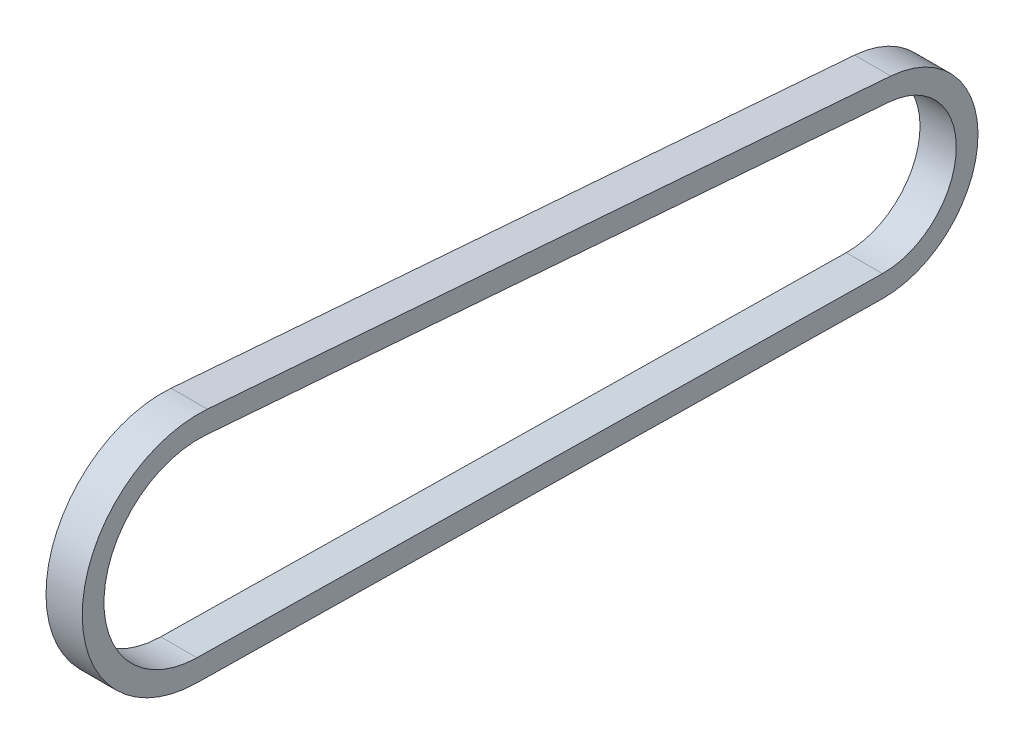
ISO-10303-21;
HEADER;
FILE_DESCRIPTION(('STEP AP214'),'2;1');
FILE_NAME('part.step','',(''),(''),'','','');
FILE_SCHEMA(('AUTOMOTIVE_DESIGN { 1 0 10303 214 1 1 1 1 }'));
ENDSEC;
DATA;
#1=APPLICATION_CONTEXT('core data for automotive mechanical design processes');
#2=APPLICATION_PROTOCOL_DEFINITION('international standard','automotive_design',2000,#1);
#3=PRODUCT_CONTEXT('',#1,'mechanical');
#4=PRODUCT('Part','Part','',(#3));
#5=PRODUCT_RELATED_PRODUCT_CATEGORY('part','',(#4));
#6=PRODUCT_DEFINITION_FORMATION('','',#4);
#7=PRODUCT_DEFINITION_CONTEXT('part definition',#1,'design');
#8=PRODUCT_DEFINITION('design','',#6,#7);
#9=PRODUCT_DEFINITION_SHAPE('','',#8);
#10=(LENGTH_UNIT() NAMED_UNIT(*) SI_UNIT(.MILLI.,.METRE.));
#11=(NAMED_UNIT(*) PLANE_ANGLE_UNIT() SI_UNIT($,.RADIAN.));
#12=(NAMED_UNIT(*) SI_UNIT($,.STERADIAN.) SOLID_ANGLE_UNIT());
#13=UNCERTAINTY_MEASURE_WITH_UNIT(LENGTH_MEASURE(1.E-05),#10,'distance_accuracy_value','');
#14=(GEOMETRIC_REPRESENTATION_CONTEXT(3) GLOBAL_UNCERTAINTY_ASSIGNED_CONTEXT((#13)) GLOBAL_UNIT_ASSIGNED_CONTEXT((#10,
#11,#12)) REPRESENTATION_CONTEXT('',''));
#15=CARTESIAN_POINT('',(0.,0.,0.));
#16=DIRECTION('',(0.,0.,1.));
#17=DIRECTION('',(1.,0.,0.));
#18=AXIS2_PLACEMENT_3D('',#15,#16,#17);
#19=CARTESIAN_POINT('',(52.5000000000001,17.5,83.629055924294));
#20=DIRECTION('',(1.,0.,0.));
#21=DIRECTION('',(0.,0.,-1.));
#22=AXIS2_PLACEMENT_3D('',#19,#20,#21);
#23=PLANE('',#22);
#24=CARTESIAN_POINT('',(52.5000000000001,17.5,83.629055924294));
#25=DIRECTION('',(1.,0.,0.));
#26=DIRECTION('',(0.,0.,-1.));
#27=AXIS2_PLACEMENT_3D('',#24,#25,#26);
#28=CIRCLE('',#27,12.814);
#29=CARTESIAN_POINT('',(52.5000000000001,30.2752862936995,82.6337388321));
#30=VERTEX_POINT('',#29);
#31=CARTESIAN_POINT('',(52.5000000000001,4.68739172846032,83.8179084595509));
#32=VERTEX_POINT('',#31);
#33=EDGE_CURVE('E140',#30,#32,#28,.T.);
#34=ORIENTED_EDGE('',*,*,#33,.T.);
#35=DIRECTION('',(0.,-0.0147379846462386,-0.999891390006218));
#36=VECTOR('',#35,1.);
#37=CARTESIAN_POINT('',(52.5,3.57213269362515,8.15370244187558));
#38=LINE('',#37,#36);
#39=CARTESIAN_POINT('',(52.5,3.57213269362515,8.15370244187558));
#40=VERTEX_POINT('',#39);
#41=EDGE_CURVE('E143',#32,#40,#38,.T.);
#42=ORIENTED_EDGE('',*,*,#41,.T.);
#43=CARTESIAN_POINT('',(52.5,14.,8.));
#44=DIRECTION('',(1.,0.,0.));
#45=DIRECTION('',(0.,0.,-1.));
#46=AXIS2_PLACEMENT_3D('',#43,#44,#45);
#47=CIRCLE('',#46,10.429);
#48=CARTESIAN_POINT('',(52.5,24.3974918649128,7.18993585496394));
#49=VERTEX_POINT('',#48);
#50=EDGE_CURVE('E146',#40,#49,#47,.T.);
#51=ORIENTED_EDGE('',*,*,#50,.T.);
#52=DIRECTION('',(0.,0.0776741916805083,0.996978796136999));
#53=VECTOR('',#52,1.);
#54=CARTESIAN_POINT('',(52.5000000000001,30.2752862936995,82.6337388321));
#55=LINE('',#54,#53);
#56=EDGE_CURVE('E148',#49,#30,#55,.T.);
#57=ORIENTED_EDGE('',*,*,#56,.T.);
#58=EDGE_LOOP('',(#34,#42,#51,#57));
#59=FACE_BOUND('',#58,.T.);
#60=DIRECTION('',(0.,-0.0147379846462386,-0.999891390006218));
#61=VECTOR('',#60,1.);
#62=CARTESIAN_POINT('',(52.5,5.97187202964007,8.11833127872461));
#63=LINE('',#62,#61);
#64=CARTESIAN_POINT('',(52.5000000000001,7.08713106447524,83.7825372964));
#65=VERTEX_POINT('',#64);
#66=CARTESIAN_POINT('',(52.5,5.97187202964007,8.11833127872461));
#67=VERTEX_POINT('',#66);
#68=EDGE_CURVE('E112',#65,#67,#63,.T.);
#69=ORIENTED_EDGE('',*,*,#68,.F.);
#70=CARTESIAN_POINT('',(52.5000000000001,17.5,83.629055924294));
#71=DIRECTION('',(1.,0.,0.));
#72=DIRECTION('',(0.,0.,-1.));
#73=AXIS2_PLACEMENT_3D('',#70,#71,#72);
#74=CIRCLE('',#73,10.414);
#75=CARTESIAN_POINT('',(52.5000000000001,27.8825371829707,82.8201568921332));
#76=VERTEX_POINT('',#75);
#77=EDGE_CURVE('E104',#76,#65,#74,.T.);
#78=ORIENTED_EDGE('',*,*,#77,.F.);
#79=DIRECTION('',(0.,0.0776741916805083,0.996978796136999));
#80=VECTOR('',#79,1.);
#81=CARTESIAN_POINT('',(52.5000000000001,27.8825371829707,82.8201568921332));
#82=LINE('',#81,#80);
#83=CARTESIAN_POINT('',(52.5,22.004742754184,7.37635391499716));
#84=VERTEX_POINT('',#83);
#85=EDGE_CURVE('E126',#84,#76,#82,.T.);
#86=ORIENTED_EDGE('',*,*,#85,.F.);
#87=CARTESIAN_POINT('',(52.5,14.,8.));
#88=DIRECTION('',(1.,0.,0.));
#89=DIRECTION('',(0.,0.,-1.));
#90=AXIS2_PLACEMENT_3D('',#87,#88,#89);
#91=CIRCLE('',#90,8.02900000000001);
#92=EDGE_CURVE('E124',#67,#84,#91,.T.);
#93=ORIENTED_EDGE('',*,*,#92,.F.);
#94=EDGE_LOOP('',(#69,#78,#86,#93));
#95=FACE_BOUND('',#94,.T.);
#96=ADVANCED_FACE('F39',(#59,#95),#23,.T.);
#97=CARTESIAN_POINT('',(48.5000000000001,17.5,83.629055924294));
#98=DIRECTION('',(1.,0.,0.));
#99=DIRECTION('',(0.,0.,-1.));
#100=AXIS2_PLACEMENT_3D('',#97,#98,#99);
#101=PLANE('',#100);
#102=CARTESIAN_POINT('',(48.5000000000001,17.5,83.629055924294));
#103=DIRECTION('',(1.,0.,0.));
#104=DIRECTION('',(0.,0.,-1.));
#105=AXIS2_PLACEMENT_3D('',#102,#103,#104);
#106=CIRCLE('',#105,12.814);
#107=CARTESIAN_POINT('',(48.5000000000001,30.2752862936995,82.6337388321));
#108=VERTEX_POINT('',#107);
#109=CARTESIAN_POINT('',(48.5000000000001,4.68739172846032,83.8179084595509));
#110=VERTEX_POINT('',#109);
#111=EDGE_CURVE('E120',#108,#110,#106,.T.);
#112=ORIENTED_EDGE('',*,*,#111,.F.);
#113=DIRECTION('',(0.,0.0776741916805083,0.996978796136999));
#114=VECTOR('',#113,1.);
#115=CARTESIAN_POINT('',(48.5000000000001,30.2752862936995,82.6337388321));
#116=LINE('',#115,#114);
#117=CARTESIAN_POINT('',(48.5,24.3974918649128,7.18993585496394));
#118=VERTEX_POINT('',#117);
#119=EDGE_CURVE('E144',#118,#108,#116,.T.);
#120=ORIENTED_EDGE('',*,*,#119,.F.);
#121=CARTESIAN_POINT('',(48.5,14.,8.));
#122=DIRECTION('',(1.,0.,0.));
#123=DIRECTION('',(0.,0.,-1.));
#124=AXIS2_PLACEMENT_3D('',#121,#122,#123);
#125=CIRCLE('',#124,10.429);
#126=CARTESIAN_POINT('',(48.5,3.57213269362515,8.15370244187558));
#127=VERTEX_POINT('',#126);
#128=EDGE_CURVE('E155',#127,#118,#125,.T.);
#129=ORIENTED_EDGE('',*,*,#128,.F.);
#130=DIRECTION('',(0.,-0.0147379846462386,-0.999891390006218));
#131=VECTOR('',#130,1.);
#132=CARTESIAN_POINT('',(48.5,3.57213269362515,8.15370244187559));
#133=LINE('',#132,#131);
#134=EDGE_CURVE('E153',#110,#127,#133,.T.);
#135=ORIENTED_EDGE('',*,*,#134,.F.);
#136=EDGE_LOOP('',(#112,#120,#129,#135));
#137=FACE_BOUND('',#136,.T.);
#138=CARTESIAN_POINT('',(48.5000000000001,17.5,83.629055924294));
#139=DIRECTION('',(1.,0.,0.));
#140=DIRECTION('',(0.,0.,-1.));
#141=AXIS2_PLACEMENT_3D('',#138,#139,#140);
#142=CIRCLE('',#141,10.414);
#143=CARTESIAN_POINT('',(48.5000000000001,27.8825371829707,82.8201568921332));
#144=VERTEX_POINT('',#143);
#145=CARTESIAN_POINT('',(48.5000000000001,7.08713106447524,83.7825372964));
#146=VERTEX_POINT('',#145);
#147=EDGE_CURVE('E62',#144,#146,#142,.T.);
#148=ORIENTED_EDGE('',*,*,#147,.T.);
#149=DIRECTION('',(0.,-0.0147379846462386,-0.999891390006218));
#150=VECTOR('',#149,1.);
#151=CARTESIAN_POINT('',(48.5,5.97187202964007,8.11833127872461));
#152=LINE('',#151,#150);
#153=CARTESIAN_POINT('',(48.5,5.97187202964007,8.11833127872461));
#154=VERTEX_POINT('',#153);
#155=EDGE_CURVE('E119',#146,#154,#152,.T.);
#156=ORIENTED_EDGE('',*,*,#155,.T.);
#157=CARTESIAN_POINT('',(48.5,14.,8.));
#158=DIRECTION('',(1.,0.,0.));
#159=DIRECTION('',(0.,0.,-1.));
#160=AXIS2_PLACEMENT_3D('',#157,#158,#159);
#161=CIRCLE('',#160,8.02900000000001);
#162=CARTESIAN_POINT('',(48.5,22.004742754184,7.37635391499717));
#163=VERTEX_POINT('',#162);
#164=EDGE_CURVE('E132',#154,#163,#161,.T.);
#165=ORIENTED_EDGE('',*,*,#164,.T.);
#166=DIRECTION('',(0.,0.0776741916805083,0.996978796136999));
#167=VECTOR('',#166,1.);
#168=CARTESIAN_POINT('',(48.5000000000001,27.8825371829707,82.8201568921332));
#169=LINE('',#168,#167);
#170=EDGE_CURVE('E113',#163,#144,#169,.T.);
#171=ORIENTED_EDGE('',*,*,#170,.T.);
#172=EDGE_LOOP('',(#148,#156,#165,#171));
#173=FACE_BOUND('',#172,.T.);
#174=ADVANCED_FACE('F173',(#137,#173),#101,.F.);
#175=CARTESIAN_POINT('',(52.5000000000001,17.5,83.629055924294));
#176=DIRECTION('',(-1.,0.,0.));
#177=DIRECTION('',(0.,0.,1.));
#178=AXIS2_PLACEMENT_3D('',#175,#176,#177);
#179=CYLINDRICAL_SURFACE('',#178,12.814);
#180=ORIENTED_EDGE('',*,*,#111,.T.);
#181=DIRECTION('',(-1.,0.,0.));
#182=VECTOR('',#181,1.);
#183=CARTESIAN_POINT('',(52.5000000000001,4.68739172846032,83.8179084595509));
#184=LINE('',#183,#182);
#185=EDGE_CURVE('E11',#32,#110,#184,.T.);
#186=ORIENTED_EDGE('',*,*,#185,.F.);
#187=ORIENTED_EDGE('',*,*,#33,.F.);
#188=DIRECTION('',(-1.,0.,0.));
#189=VECTOR('',#188,1.);
#190=CARTESIAN_POINT('',(52.5000000000001,30.2752862936995,82.6337388321));
#191=LINE('',#190,#189);
#192=EDGE_CURVE('E150',#30,#108,#191,.T.);
#193=ORIENTED_EDGE('',*,*,#192,.T.);
#194=EDGE_LOOP('',(#180,#186,#187,#193));
#195=FACE_BOUND('',#194,.T.);
#196=ADVANCED_FACE('F41',(#195),#179,.T.);
#197=CARTESIAN_POINT('',(52.5,3.57213269362515,8.15370244187558));
#198=DIRECTION('',(0.,0.999891390006218,-0.0147379846462386));
#199=DIRECTION('',(0.,0.0147379846462386,0.999891390006218));
#200=AXIS2_PLACEMENT_3D('',#197,#198,#199);
#201=PLANE('',#200);
#202=ORIENTED_EDGE('',*,*,#134,.T.);
#203=DIRECTION('',(-1.,0.,0.));
#204=VECTOR('',#203,1.);
#205=CARTESIAN_POINT('',(52.5,3.57213269362515,8.15370244187558));
#206=LINE('',#205,#204);
#207=EDGE_CURVE('E47',#40,#127,#206,.T.);
#208=ORIENTED_EDGE('',*,*,#207,.F.);
#209=ORIENTED_EDGE('',*,*,#41,.F.);
#210=ORIENTED_EDGE('',*,*,#185,.T.);
#211=EDGE_LOOP('',(#202,#208,#209,#210));
#212=FACE_BOUND('',#211,.T.);
#213=ADVANCED_FACE('F183',(#212),#201,.F.);
#214=CARTESIAN_POINT('',(52.5,14.,8.));
#215=DIRECTION('',(-1.,0.,0.));
#216=DIRECTION('',(0.,0.,1.));
#217=AXIS2_PLACEMENT_3D('',#214,#215,#216);
#218=CYLINDRICAL_SURFACE('',#217,10.429);
#219=ORIENTED_EDGE('',*,*,#128,.T.);
#220=DIRECTION('',(-1.,0.,0.));
#221=VECTOR('',#220,1.);
#222=CARTESIAN_POINT('',(52.5,24.3974918649128,7.18993585496394));
#223=LINE('',#222,#221);
#224=EDGE_CURVE('E160',#49,#118,#223,.T.);
#225=ORIENTED_EDGE('',*,*,#224,.F.);
#226=ORIENTED_EDGE('',*,*,#50,.F.);
#227=ORIENTED_EDGE('',*,*,#207,.T.);
#228=EDGE_LOOP('',(#219,#225,#226,#227));
#229=FACE_BOUND('',#228,.T.);
#230=ADVANCED_FACE('F167',(#229),#218,.T.);
#231=CARTESIAN_POINT('',(52.5000000000001,30.2752862936995,82.6337388321));
#232=DIRECTION('',(0.,-0.996978796136999,0.0776741916805083));
#233=DIRECTION('',(0.,-0.0776741916805083,-0.996978796136999));
#234=AXIS2_PLACEMENT_3D('',#231,#232,#233);
#235=PLANE('',#234);
#236=ORIENTED_EDGE('',*,*,#119,.T.);
#237=ORIENTED_EDGE('',*,*,#192,.F.);
#238=ORIENTED_EDGE('',*,*,#56,.F.);
#239=ORIENTED_EDGE('',*,*,#224,.T.);
#240=EDGE_LOOP('',(#236,#237,#238,#239));
#241=FACE_BOUND('',#240,.T.);
#242=ADVANCED_FACE('F177',(#241),#235,.F.);
#243=CARTESIAN_POINT('',(52.5000000000001,17.5,83.629055924294));
#244=DIRECTION('',(-1.,0.,0.));
#245=DIRECTION('',(0.,0.,1.));
#246=AXIS2_PLACEMENT_3D('',#243,#244,#245);
#247=CYLINDRICAL_SURFACE('',#246,10.414);
#248=ORIENTED_EDGE('',*,*,#147,.F.);
#249=DIRECTION('',(-1.,0.,0.));
#250=VECTOR('',#249,1.);
#251=CARTESIAN_POINT('',(52.5000000000001,27.8825371829707,82.8201568921332));
#252=LINE('',#251,#250);
#253=EDGE_CURVE('E108',#76,#144,#252,.T.);
#254=ORIENTED_EDGE('',*,*,#253,.F.);
#255=ORIENTED_EDGE('',*,*,#77,.T.);
#256=DIRECTION('',(-1.,0.,0.));
#257=VECTOR('',#256,1.);
#258=CARTESIAN_POINT('',(52.5000000000001,7.08713106447524,83.7825372964));
#259=LINE('',#258,#257);
#260=EDGE_CURVE('E107',#65,#146,#259,.T.);
#261=ORIENTED_EDGE('',*,*,#260,.T.);
#262=EDGE_LOOP('',(#248,#254,#255,#261));
#263=FACE_BOUND('',#262,.T.);
#264=ADVANCED_FACE('F106',(#263),#247,.F.);
#265=CARTESIAN_POINT('',(52.5,5.97187202964007,8.11833127872461));
#266=DIRECTION('',(0.,0.999891390006218,-0.0147379846462386));
#267=DIRECTION('',(0.,0.0147379846462386,0.999891390006218));
#268=AXIS2_PLACEMENT_3D('',#265,#266,#267);
#269=PLANE('',#268);
#270=ORIENTED_EDGE('',*,*,#155,.F.);
#271=ORIENTED_EDGE('',*,*,#260,.F.);
#272=ORIENTED_EDGE('',*,*,#68,.T.);
#273=DIRECTION('',(-1.,0.,0.));
#274=VECTOR('',#273,1.);
#275=CARTESIAN_POINT('',(52.5,5.97187202964007,8.11833127872461));
#276=LINE('',#275,#274);
#277=EDGE_CURVE('E121',#67,#154,#276,.T.);
#278=ORIENTED_EDGE('',*,*,#277,.T.);
#279=EDGE_LOOP('',(#270,#271,#272,#278));
#280=FACE_BOUND('',#279,.T.);
#281=ADVANCED_FACE('F116',(#280),#269,.T.);
#282=CARTESIAN_POINT('',(52.5,14.,8.));
#283=DIRECTION('',(-1.,0.,0.));
#284=DIRECTION('',(0.,0.,1.));
#285=AXIS2_PLACEMENT_3D('',#282,#283,#284);
#286=CYLINDRICAL_SURFACE('',#285,8.02900000000001);
#287=ORIENTED_EDGE('',*,*,#164,.F.);
#288=ORIENTED_EDGE('',*,*,#277,.F.);
#289=ORIENTED_EDGE('',*,*,#92,.T.);
#290=DIRECTION('',(-1.,0.,0.));
#291=VECTOR('',#290,1.);
#292=CARTESIAN_POINT('',(52.5,22.004742754184,7.37635391499717));
#293=LINE('',#292,#291);
#294=EDGE_CURVE('E54',#84,#163,#293,.T.);
#295=ORIENTED_EDGE('',*,*,#294,.T.);
#296=EDGE_LOOP('',(#287,#288,#289,#295));
#297=FACE_BOUND('',#296,.T.);
#298=ADVANCED_FACE('F210',(#297),#286,.F.);
#299=CARTESIAN_POINT('',(52.5000000000001,27.8825371829707,82.8201568921332));
#300=DIRECTION('',(0.,-0.996978796136999,0.0776741916805083));
#301=DIRECTION('',(0.,-0.0776741916805083,-0.996978796136999));
#302=AXIS2_PLACEMENT_3D('',#299,#300,#301);
#303=PLANE('',#302);
#304=ORIENTED_EDGE('',*,*,#170,.F.);
#305=ORIENTED_EDGE('',*,*,#294,.F.);
#306=ORIENTED_EDGE('',*,*,#85,.T.);
#307=ORIENTED_EDGE('',*,*,#253,.T.);
#308=EDGE_LOOP('',(#304,#305,#306,#307));
#309=FACE_BOUND('',#308,.T.);
#310=ADVANCED_FACE('F215',(#309),#303,.T.);
#311=CLOSED_SHELL('',(#96,#174,#196,#213,#230,#242,#264,#281,#298,#310));
#312=MANIFOLD_SOLID_BREP('B2',#311);
#313=ADVANCED_BREP_SHAPE_REPRESENTATION('',(#18,#312),#14);
#314=SHAPE_DEFINITION_REPRESENTATION(#9,#313);
ENDSEC;
END-ISO-10303-21;
